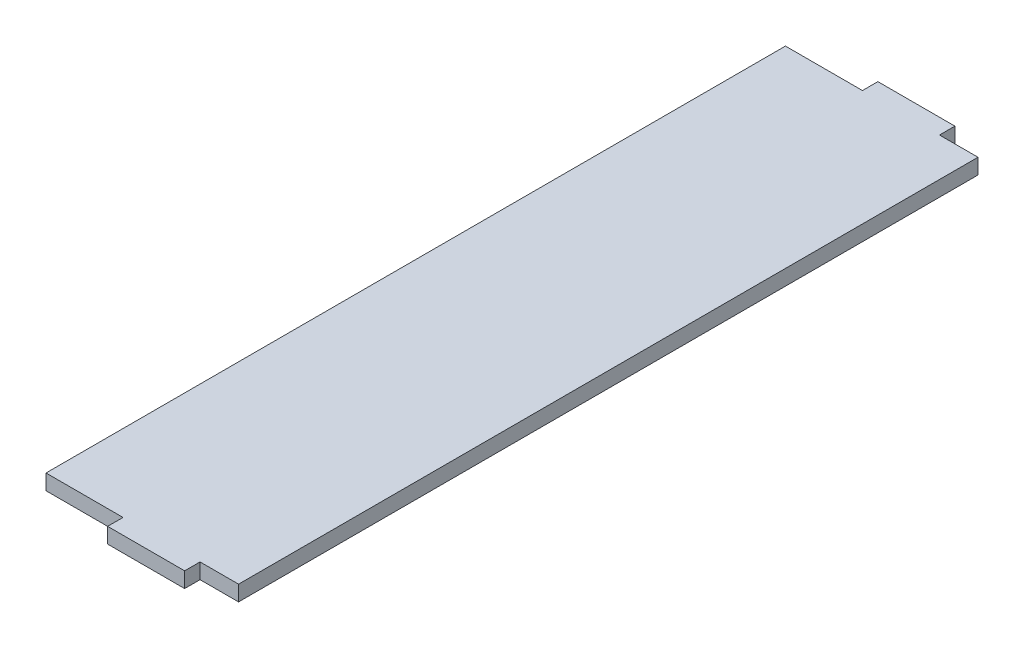
ISO-10303-21;
HEADER;
FILE_DESCRIPTION(('STEP AP214'),'2;1');
FILE_NAME('part.step','',(''),(''),'','','');
FILE_SCHEMA(('AUTOMOTIVE_DESIGN { 1 0 10303 214 1 1 1 1 }'));
ENDSEC;
DATA;
#1=APPLICATION_CONTEXT('core data for automotive mechanical design processes');
#2=APPLICATION_PROTOCOL_DEFINITION('international standard','automotive_design',2000,#1);
#3=PRODUCT_CONTEXT('',#1,'mechanical');
#4=PRODUCT('Part','Part','',(#3));
#5=PRODUCT_RELATED_PRODUCT_CATEGORY('part','',(#4));
#6=PRODUCT_DEFINITION_FORMATION('','',#4);
#7=PRODUCT_DEFINITION_CONTEXT('part definition',#1,'design');
#8=PRODUCT_DEFINITION('design','',#6,#7);
#9=PRODUCT_DEFINITION_SHAPE('','',#8);
#10=(LENGTH_UNIT() NAMED_UNIT(*) SI_UNIT(.MILLI.,.METRE.));
#11=(NAMED_UNIT(*) PLANE_ANGLE_UNIT() SI_UNIT($,.RADIAN.));
#12=(NAMED_UNIT(*) SI_UNIT($,.STERADIAN.) SOLID_ANGLE_UNIT());
#13=UNCERTAINTY_MEASURE_WITH_UNIT(LENGTH_MEASURE(1.E-05),#10,'distance_accuracy_value','');
#14=(GEOMETRIC_REPRESENTATION_CONTEXT(3) GLOBAL_UNCERTAINTY_ASSIGNED_CONTEXT((#13)) GLOBAL_UNIT_ASSIGNED_CONTEXT((#10,
#11,#12)) REPRESENTATION_CONTEXT('',''));
#15=CARTESIAN_POINT('',(0.,0.,0.));
#16=DIRECTION('',(0.,0.,1.));
#17=DIRECTION('',(1.,0.,0.));
#18=AXIS2_PLACEMENT_3D('',#15,#16,#17);
#19=CARTESIAN_POINT('',(30.,6.,0.));
#20=DIRECTION('',(0.,0.,-1.));
#21=DIRECTION('',(-1.,0.,0.));
#22=AXIS2_PLACEMENT_3D('',#19,#20,#21);
#23=PLANE('',#22);
#24=DIRECTION('',(1.,0.,0.));
#25=VECTOR('',#24,1.);
#26=CARTESIAN_POINT('',(30.,0.,0.));
#27=LINE('',#26,#25);
#28=CARTESIAN_POINT('',(0.,0.,0.));
#29=VERTEX_POINT('',#28);
#30=CARTESIAN_POINT('',(30.,0.,0.));
#31=VERTEX_POINT('',#30);
#32=EDGE_CURVE('E154',#29,#31,#27,.T.);
#33=ORIENTED_EDGE('',*,*,#32,.T.);
#34=DIRECTION('',(0.,-1.,0.));
#35=VECTOR('',#34,1.);
#36=CARTESIAN_POINT('',(30.,6.,0.));
#37=LINE('',#36,#35);
#38=CARTESIAN_POINT('',(30.,6.,0.));
#39=VERTEX_POINT('',#38);
#40=EDGE_CURVE('E11',#39,#31,#37,.T.);
#41=ORIENTED_EDGE('',*,*,#40,.F.);
#42=DIRECTION('',(1.,0.,0.));
#43=VECTOR('',#42,1.);
#44=CARTESIAN_POINT('',(30.,6.,0.));
#45=LINE('',#44,#43);
#46=CARTESIAN_POINT('',(0.,6.,0.));
#47=VERTEX_POINT('',#46);
#48=EDGE_CURVE('E176',#47,#39,#45,.T.);
#49=ORIENTED_EDGE('',*,*,#48,.F.);
#50=DIRECTION('',(0.,-1.,0.));
#51=VECTOR('',#50,1.);
#52=CARTESIAN_POINT('',(0.,6.,0.));
#53=LINE('',#52,#51);
#54=EDGE_CURVE('E150',#47,#29,#53,.T.);
#55=ORIENTED_EDGE('',*,*,#54,.T.);
#56=EDGE_LOOP('',(#33,#41,#49,#55));
#57=FACE_BOUND('',#56,.T.);
#58=ADVANCED_FACE('F34',(#57),#23,.F.);
#59=CARTESIAN_POINT('',(30.,6.,6.00000000000001));
#60=DIRECTION('',(1.,0.,0.));
#61=DIRECTION('',(0.,0.,-1.));
#62=AXIS2_PLACEMENT_3D('',#59,#60,#61);
#63=PLANE('',#62);
#64=DIRECTION('',(0.,0.,1.));
#65=VECTOR('',#64,1.);
#66=CARTESIAN_POINT('',(30.,0.,6.00000000000001));
#67=LINE('',#66,#65);
#68=CARTESIAN_POINT('',(30.,0.,6.00000000000001));
#69=VERTEX_POINT('',#68);
#70=EDGE_CURVE('E157',#31,#69,#67,.T.);
#71=ORIENTED_EDGE('',*,*,#70,.T.);
#72=DIRECTION('',(0.,-1.,0.));
#73=VECTOR('',#72,1.);
#74=CARTESIAN_POINT('',(30.,6.,6.00000000000001));
#75=LINE('',#74,#73);
#76=CARTESIAN_POINT('',(30.,6.,6.00000000000001));
#77=VERTEX_POINT('',#76);
#78=EDGE_CURVE('E42',#77,#69,#75,.T.);
#79=ORIENTED_EDGE('',*,*,#78,.F.);
#80=DIRECTION('',(0.,0.,1.));
#81=VECTOR('',#80,1.);
#82=CARTESIAN_POINT('',(30.,6.,6.00000000000001));
#83=LINE('',#82,#81);
#84=EDGE_CURVE('E105',#39,#77,#83,.T.);
#85=ORIENTED_EDGE('',*,*,#84,.F.);
#86=ORIENTED_EDGE('',*,*,#40,.T.);
#87=EDGE_LOOP('',(#71,#79,#85,#86));
#88=FACE_BOUND('',#87,.T.);
#89=ADVANCED_FACE('F254',(#88),#63,.F.);
#90=CARTESIAN_POINT('',(30.,6.,6.00000000000001));
#91=DIRECTION('',(0.,0.,-1.));
#92=DIRECTION('',(-1.,0.,0.));
#93=AXIS2_PLACEMENT_3D('',#90,#91,#92);
#94=PLANE('',#93);
#95=DIRECTION('',(1.,0.,0.));
#96=VECTOR('',#95,1.);
#97=CARTESIAN_POINT('',(30.,0.,6.00000000000001));
#98=LINE('',#97,#96);
#99=CARTESIAN_POINT('',(60.,0.,6.00000000000001));
#100=VERTEX_POINT('',#99);
#101=EDGE_CURVE('E159',#69,#100,#98,.T.);
#102=ORIENTED_EDGE('',*,*,#101,.T.);
#103=DIRECTION('',(0.,-1.,0.));
#104=VECTOR('',#103,1.);
#105=CARTESIAN_POINT('',(60.,6.,6.00000000000001));
#106=LINE('',#105,#104);
#107=CARTESIAN_POINT('',(60.,6.,6.00000000000001));
#108=VERTEX_POINT('',#107);
#109=EDGE_CURVE('E195',#108,#100,#106,.T.);
#110=ORIENTED_EDGE('',*,*,#109,.F.);
#111=DIRECTION('',(1.,0.,0.));
#112=VECTOR('',#111,1.);
#113=CARTESIAN_POINT('',(30.,6.,6.00000000000001));
#114=LINE('',#113,#112);
#115=EDGE_CURVE('E203',#77,#108,#114,.T.);
#116=ORIENTED_EDGE('',*,*,#115,.F.);
#117=ORIENTED_EDGE('',*,*,#78,.T.);
#118=EDGE_LOOP('',(#102,#110,#116,#117));
#119=FACE_BOUND('',#118,.T.);
#120=ADVANCED_FACE('F201',(#119),#94,.F.);
#121=CARTESIAN_POINT('',(60.,6.,6.00000000000001));
#122=DIRECTION('',(-1.,0.,0.));
#123=DIRECTION('',(0.,0.,1.));
#124=AXIS2_PLACEMENT_3D('',#121,#122,#123);
#125=PLANE('',#124);
#126=DIRECTION('',(0.,0.,-1.));
#127=VECTOR('',#126,1.);
#128=CARTESIAN_POINT('',(60.,0.,6.00000000000001));
#129=LINE('',#128,#127);
#130=CARTESIAN_POINT('',(60.,0.,0.));
#131=VERTEX_POINT('',#130);
#132=EDGE_CURVE('E161',#100,#131,#129,.T.);
#133=ORIENTED_EDGE('',*,*,#132,.T.);
#134=DIRECTION('',(0.,-1.,0.));
#135=VECTOR('',#134,1.);
#136=CARTESIAN_POINT('',(60.,6.,0.));
#137=LINE('',#136,#135);
#138=CARTESIAN_POINT('',(60.,6.,0.));
#139=VERTEX_POINT('',#138);
#140=EDGE_CURVE('E192',#139,#131,#137,.T.);
#141=ORIENTED_EDGE('',*,*,#140,.F.);
#142=DIRECTION('',(0.,0.,-1.));
#143=VECTOR('',#142,1.);
#144=CARTESIAN_POINT('',(60.,6.,6.00000000000001));
#145=LINE('',#144,#143);
#146=EDGE_CURVE('E221',#108,#139,#145,.T.);
#147=ORIENTED_EDGE('',*,*,#146,.F.);
#148=ORIENTED_EDGE('',*,*,#109,.T.);
#149=EDGE_LOOP('',(#133,#141,#147,#148));
#150=FACE_BOUND('',#149,.T.);
#151=ADVANCED_FACE('F212',(#150),#125,.F.);
#152=CARTESIAN_POINT('',(75.,6.,0.));
#153=DIRECTION('',(0.,0.,-1.));
#154=DIRECTION('',(-1.,0.,0.));
#155=AXIS2_PLACEMENT_3D('',#152,#153,#154);
#156=PLANE('',#155);
#157=DIRECTION('',(1.,0.,0.));
#158=VECTOR('',#157,1.);
#159=CARTESIAN_POINT('',(75.,0.,0.));
#160=LINE('',#159,#158);
#161=CARTESIAN_POINT('',(75.,0.,0.));
#162=VERTEX_POINT('',#161);
#163=EDGE_CURVE('E163',#131,#162,#160,.T.);
#164=ORIENTED_EDGE('',*,*,#163,.T.);
#165=DIRECTION('',(0.,-1.,0.));
#166=VECTOR('',#165,1.);
#167=CARTESIAN_POINT('',(75.,6.,0.));
#168=LINE('',#167,#166);
#169=CARTESIAN_POINT('',(75.,6.,0.));
#170=VERTEX_POINT('',#169);
#171=EDGE_CURVE('E189',#170,#162,#168,.T.);
#172=ORIENTED_EDGE('',*,*,#171,.F.);
#173=DIRECTION('',(1.,0.,0.));
#174=VECTOR('',#173,1.);
#175=CARTESIAN_POINT('',(75.,6.,0.));
#176=LINE('',#175,#174);
#177=EDGE_CURVE('E218',#139,#170,#176,.T.);
#178=ORIENTED_EDGE('',*,*,#177,.F.);
#179=ORIENTED_EDGE('',*,*,#140,.T.);
#180=EDGE_LOOP('',(#164,#172,#178,#179));
#181=FACE_BOUND('',#180,.T.);
#182=ADVANCED_FACE('F216',(#181),#156,.F.);
#183=CARTESIAN_POINT('',(75.,6.,-288.));
#184=DIRECTION('',(-1.,0.,0.));
#185=DIRECTION('',(0.,0.,1.));
#186=AXIS2_PLACEMENT_3D('',#183,#184,#185);
#187=PLANE('',#186);
#188=DIRECTION('',(0.,0.,-1.));
#189=VECTOR('',#188,1.);
#190=CARTESIAN_POINT('',(75.,0.,-288.));
#191=LINE('',#190,#189);
#192=CARTESIAN_POINT('',(75.,0.,-288.));
#193=VERTEX_POINT('',#192);
#194=EDGE_CURVE('E165',#162,#193,#191,.T.);
#195=ORIENTED_EDGE('',*,*,#194,.T.);
#196=DIRECTION('',(0.,-1.,0.));
#197=VECTOR('',#196,1.);
#198=CARTESIAN_POINT('',(75.,6.,-288.));
#199=LINE('',#198,#197);
#200=CARTESIAN_POINT('',(75.,6.,-288.));
#201=VERTEX_POINT('',#200);
#202=EDGE_CURVE('E186',#201,#193,#199,.T.);
#203=ORIENTED_EDGE('',*,*,#202,.F.);
#204=DIRECTION('',(0.,0.,-1.));
#205=VECTOR('',#204,1.);
#206=CARTESIAN_POINT('',(75.,6.,-288.));
#207=LINE('',#206,#205);
#208=EDGE_CURVE('E220',#170,#201,#207,.T.);
#209=ORIENTED_EDGE('',*,*,#208,.F.);
#210=ORIENTED_EDGE('',*,*,#171,.T.);
#211=EDGE_LOOP('',(#195,#203,#209,#210));
#212=FACE_BOUND('',#211,.T.);
#213=ADVANCED_FACE('F267',(#212),#187,.F.);
#214=CARTESIAN_POINT('',(75.,6.,-288.));
#215=DIRECTION('',(0.,0.,1.));
#216=DIRECTION('',(1.,0.,0.));
#217=AXIS2_PLACEMENT_3D('',#214,#215,#216);
#218=PLANE('',#217);
#219=DIRECTION('',(-1.,0.,0.));
#220=VECTOR('',#219,1.);
#221=CARTESIAN_POINT('',(75.,0.,-288.));
#222=LINE('',#221,#220);
#223=CARTESIAN_POINT('',(60.,0.,-288.));
#224=VERTEX_POINT('',#223);
#225=EDGE_CURVE('E167',#193,#224,#222,.T.);
#226=ORIENTED_EDGE('',*,*,#225,.T.);
#227=DIRECTION('',(0.,-1.,0.));
#228=VECTOR('',#227,1.);
#229=CARTESIAN_POINT('',(60.,6.,-288.));
#230=LINE('',#229,#228);
#231=CARTESIAN_POINT('',(60.,6.,-288.));
#232=VERTEX_POINT('',#231);
#233=EDGE_CURVE('E183',#232,#224,#230,.T.);
#234=ORIENTED_EDGE('',*,*,#233,.F.);
#235=DIRECTION('',(-1.,0.,0.));
#236=VECTOR('',#235,1.);
#237=CARTESIAN_POINT('',(75.,6.,-288.));
#238=LINE('',#237,#236);
#239=EDGE_CURVE('E223',#201,#232,#238,.T.);
#240=ORIENTED_EDGE('',*,*,#239,.F.);
#241=ORIENTED_EDGE('',*,*,#202,.T.);
#242=EDGE_LOOP('',(#226,#234,#240,#241));
#243=FACE_BOUND('',#242,.T.);
#244=ADVANCED_FACE('F270',(#243),#218,.F.);
#245=CARTESIAN_POINT('',(60.,6.,-294.));
#246=DIRECTION('',(-1.,0.,0.));
#247=DIRECTION('',(0.,0.,1.));
#248=AXIS2_PLACEMENT_3D('',#245,#246,#247);
#249=PLANE('',#248);
#250=DIRECTION('',(0.,0.,-1.));
#251=VECTOR('',#250,1.);
#252=CARTESIAN_POINT('',(60.,0.,-294.));
#253=LINE('',#252,#251);
#254=CARTESIAN_POINT('',(60.,0.,-294.));
#255=VERTEX_POINT('',#254);
#256=EDGE_CURVE('E169',#224,#255,#253,.T.);
#257=ORIENTED_EDGE('',*,*,#256,.T.);
#258=DIRECTION('',(0.,-1.,0.));
#259=VECTOR('',#258,1.);
#260=CARTESIAN_POINT('',(60.,6.,-294.));
#261=LINE('',#260,#259);
#262=CARTESIAN_POINT('',(60.,6.,-294.));
#263=VERTEX_POINT('',#262);
#264=EDGE_CURVE('E180',#263,#255,#261,.T.);
#265=ORIENTED_EDGE('',*,*,#264,.F.);
#266=DIRECTION('',(0.,0.,-1.));
#267=VECTOR('',#266,1.);
#268=CARTESIAN_POINT('',(60.,6.,-294.));
#269=LINE('',#268,#267);
#270=EDGE_CURVE('E229',#232,#263,#269,.T.);
#271=ORIENTED_EDGE('',*,*,#270,.F.);
#272=ORIENTED_EDGE('',*,*,#233,.T.);
#273=EDGE_LOOP('',(#257,#265,#271,#272));
#274=FACE_BOUND('',#273,.T.);
#275=ADVANCED_FACE('F235',(#274),#249,.F.);
#276=CARTESIAN_POINT('',(30.,6.,-294.));
#277=DIRECTION('',(0.,0.,1.));
#278=DIRECTION('',(1.,0.,0.));
#279=AXIS2_PLACEMENT_3D('',#276,#277,#278);
#280=PLANE('',#279);
#281=DIRECTION('',(-1.,0.,0.));
#282=VECTOR('',#281,1.);
#283=CARTESIAN_POINT('',(30.,0.,-294.));
#284=LINE('',#283,#282);
#285=CARTESIAN_POINT('',(30.,0.,-294.));
#286=VERTEX_POINT('',#285);
#287=EDGE_CURVE('E171',#255,#286,#284,.T.);
#288=ORIENTED_EDGE('',*,*,#287,.T.);
#289=DIRECTION('',(0.,-1.,0.));
#290=VECTOR('',#289,1.);
#291=CARTESIAN_POINT('',(30.,6.,-294.));
#292=LINE('',#291,#290);
#293=CARTESIAN_POINT('',(30.,6.,-294.));
#294=VERTEX_POINT('',#293);
#295=EDGE_CURVE('E145',#294,#286,#292,.T.);
#296=ORIENTED_EDGE('',*,*,#295,.F.);
#297=DIRECTION('',(-1.,0.,0.));
#298=VECTOR('',#297,1.);
#299=CARTESIAN_POINT('',(30.,6.,-294.));
#300=LINE('',#299,#298);
#301=EDGE_CURVE('E136',#263,#294,#300,.T.);
#302=ORIENTED_EDGE('',*,*,#301,.F.);
#303=ORIENTED_EDGE('',*,*,#264,.T.);
#304=EDGE_LOOP('',(#288,#296,#302,#303));
#305=FACE_BOUND('',#304,.T.);
#306=ADVANCED_FACE('F239',(#305),#280,.F.);
#307=CARTESIAN_POINT('',(30.,6.,-294.));
#308=DIRECTION('',(1.,0.,0.));
#309=DIRECTION('',(0.,0.,-1.));
#310=AXIS2_PLACEMENT_3D('',#307,#308,#309);
#311=PLANE('',#310);
#312=DIRECTION('',(0.,0.,1.));
#313=VECTOR('',#312,1.);
#314=CARTESIAN_POINT('',(30.,0.,-294.));
#315=LINE('',#314,#313);
#316=CARTESIAN_POINT('',(30.,0.,-288.));
#317=VERTEX_POINT('',#316);
#318=EDGE_CURVE('E144',#286,#317,#315,.T.);
#319=ORIENTED_EDGE('',*,*,#318,.T.);
#320=DIRECTION('',(0.,-1.,0.));
#321=VECTOR('',#320,1.);
#322=CARTESIAN_POINT('',(30.,6.,-288.));
#323=LINE('',#322,#321);
#324=CARTESIAN_POINT('',(30.,6.,-288.));
#325=VERTEX_POINT('',#324);
#326=EDGE_CURVE('E141',#325,#317,#323,.T.);
#327=ORIENTED_EDGE('',*,*,#326,.F.);
#328=DIRECTION('',(0.,0.,1.));
#329=VECTOR('',#328,1.);
#330=CARTESIAN_POINT('',(30.,6.,-294.));
#331=LINE('',#330,#329);
#332=EDGE_CURVE('E130',#294,#325,#331,.T.);
#333=ORIENTED_EDGE('',*,*,#332,.F.);
#334=ORIENTED_EDGE('',*,*,#295,.T.);
#335=EDGE_LOOP('',(#319,#327,#333,#334));
#336=FACE_BOUND('',#335,.T.);
#337=ADVANCED_FACE('F142',(#336),#311,.F.);
#338=CARTESIAN_POINT('',(0.,6.,-288.));
#339=DIRECTION('',(0.,0.,1.));
#340=DIRECTION('',(1.,0.,0.));
#341=AXIS2_PLACEMENT_3D('',#338,#339,#340);
#342=PLANE('',#341);
#343=DIRECTION('',(-1.,0.,0.));
#344=VECTOR('',#343,1.);
#345=CARTESIAN_POINT('',(0.,0.,-288.));
#346=LINE('',#345,#344);
#347=CARTESIAN_POINT('',(0.,0.,-288.));
#348=VERTEX_POINT('',#347);
#349=EDGE_CURVE('E91',#317,#348,#346,.T.);
#350=ORIENTED_EDGE('',*,*,#349,.T.);
#351=DIRECTION('',(0.,-1.,0.));
#352=VECTOR('',#351,1.);
#353=CARTESIAN_POINT('',(0.,6.,-288.));
#354=LINE('',#353,#352);
#355=CARTESIAN_POINT('',(0.,6.,-288.));
#356=VERTEX_POINT('',#355);
#357=EDGE_CURVE('E146',#356,#348,#354,.T.);
#358=ORIENTED_EDGE('',*,*,#357,.F.);
#359=DIRECTION('',(-1.,0.,0.));
#360=VECTOR('',#359,1.);
#361=CARTESIAN_POINT('',(0.,6.,-288.));
#362=LINE('',#361,#360);
#363=EDGE_CURVE('E134',#325,#356,#362,.T.);
#364=ORIENTED_EDGE('',*,*,#363,.F.);
#365=ORIENTED_EDGE('',*,*,#326,.T.);
#366=EDGE_LOOP('',(#350,#358,#364,#365));
#367=FACE_BOUND('',#366,.T.);
#368=ADVANCED_FACE('F148',(#367),#342,.F.);
#369=CARTESIAN_POINT('',(0.,6.,0.));
#370=DIRECTION('',(1.,0.,0.));
#371=DIRECTION('',(0.,0.,-1.));
#372=AXIS2_PLACEMENT_3D('',#369,#370,#371);
#373=PLANE('',#372);
#374=DIRECTION('',(0.,0.,1.));
#375=VECTOR('',#374,1.);
#376=CARTESIAN_POINT('',(0.,0.,0.));
#377=LINE('',#376,#375);
#378=EDGE_CURVE('E97',#348,#29,#377,.T.);
#379=ORIENTED_EDGE('',*,*,#378,.T.);
#380=ORIENTED_EDGE('',*,*,#54,.F.);
#381=DIRECTION('',(0.,0.,1.));
#382=VECTOR('',#381,1.);
#383=CARTESIAN_POINT('',(0.,6.,0.));
#384=LINE('',#383,#382);
#385=EDGE_CURVE('E50',#356,#47,#384,.T.);
#386=ORIENTED_EDGE('',*,*,#385,.F.);
#387=ORIENTED_EDGE('',*,*,#357,.T.);
#388=EDGE_LOOP('',(#379,#380,#386,#387));
#389=FACE_BOUND('',#388,.T.);
#390=ADVANCED_FACE('F243',(#389),#373,.F.);
#391=CARTESIAN_POINT('',(0.,6.,0.));
#392=DIRECTION('',(0.,-1.,0.));
#393=DIRECTION('',(0.,0.,-1.));
#394=AXIS2_PLACEMENT_3D('',#391,#392,#393);
#395=PLANE('',#394);
#396=ORIENTED_EDGE('',*,*,#48,.T.);
#397=ORIENTED_EDGE('',*,*,#84,.T.);
#398=ORIENTED_EDGE('',*,*,#115,.T.);
#399=ORIENTED_EDGE('',*,*,#146,.T.);
#400=ORIENTED_EDGE('',*,*,#177,.T.);
#401=ORIENTED_EDGE('',*,*,#208,.T.);
#402=ORIENTED_EDGE('',*,*,#239,.T.);
#403=ORIENTED_EDGE('',*,*,#270,.T.);
#404=ORIENTED_EDGE('',*,*,#301,.T.);
#405=ORIENTED_EDGE('',*,*,#332,.T.);
#406=ORIENTED_EDGE('',*,*,#363,.T.);
#407=ORIENTED_EDGE('',*,*,#385,.T.);
#408=EDGE_LOOP('',(#396,#397,#398,#399,#400,#401,#402,#403,#404,#405,#406,#407));
#409=FACE_BOUND('',#408,.T.);
#410=ADVANCED_FACE('F132',(#409),#395,.F.);
#411=CARTESIAN_POINT('',(0.,0.,0.));
#412=DIRECTION('',(0.,-1.,0.));
#413=DIRECTION('',(0.,0.,-1.));
#414=AXIS2_PLACEMENT_3D('',#411,#412,#413);
#415=PLANE('',#414);
#416=ORIENTED_EDGE('',*,*,#32,.F.);
#417=ORIENTED_EDGE('',*,*,#378,.F.);
#418=ORIENTED_EDGE('',*,*,#349,.F.);
#419=ORIENTED_EDGE('',*,*,#318,.F.);
#420=ORIENTED_EDGE('',*,*,#287,.F.);
#421=ORIENTED_EDGE('',*,*,#256,.F.);
#422=ORIENTED_EDGE('',*,*,#225,.F.);
#423=ORIENTED_EDGE('',*,*,#194,.F.);
#424=ORIENTED_EDGE('',*,*,#163,.F.);
#425=ORIENTED_EDGE('',*,*,#132,.F.);
#426=ORIENTED_EDGE('',*,*,#101,.F.);
#427=ORIENTED_EDGE('',*,*,#70,.F.);
#428=EDGE_LOOP('',(#416,#417,#418,#419,#420,#421,#422,#423,#424,#425,#426,#427));
#429=FACE_BOUND('',#428,.T.);
#430=ADVANCED_FACE('F207',(#429),#415,.T.);
#431=CLOSED_SHELL('',(#58,#89,#120,#151,#182,#213,#244,#275,#306,#337,#368,#390,#410,#430));
#432=MANIFOLD_SOLID_BREP('B2',#431);
#433=ADVANCED_BREP_SHAPE_REPRESENTATION('',(#18,#432),#14);
#434=SHAPE_DEFINITION_REPRESENTATION(#9,#433);
ENDSEC;
END-ISO-10303-21;
